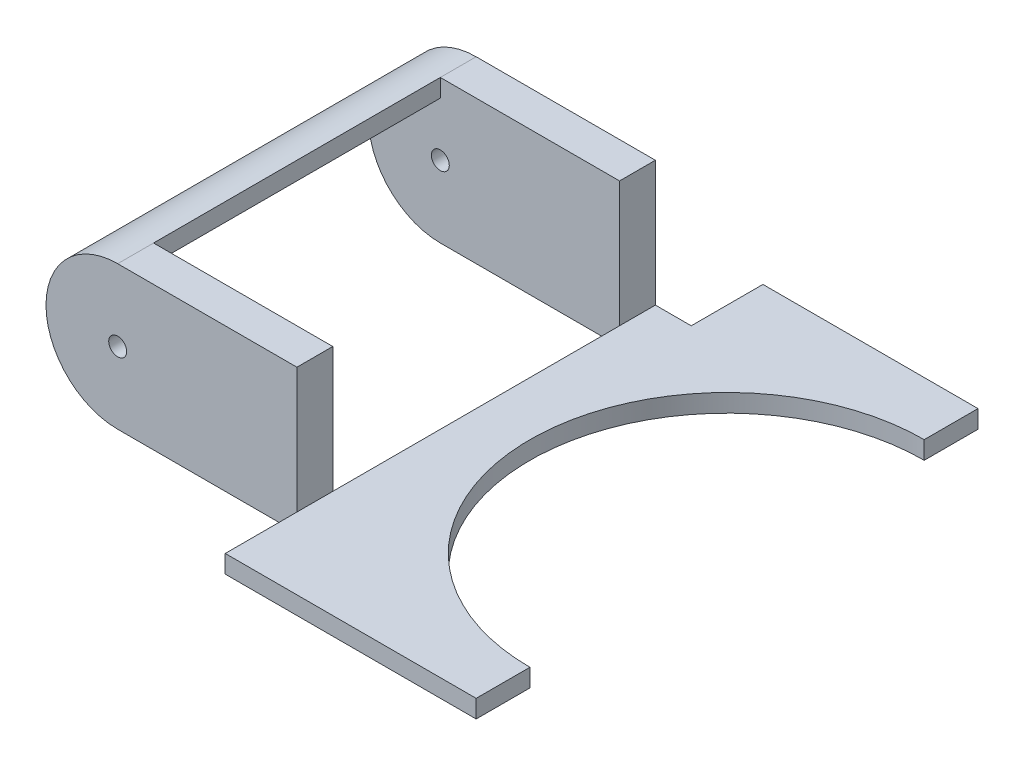
ISO-10303-21;
HEADER;
FILE_DESCRIPTION(('STEP AP214'),'2;1');
FILE_NAME('part.step','',(''),(''),'','','');
FILE_SCHEMA(('AUTOMOTIVE_DESIGN { 1 0 10303 214 1 1 1 1 }'));
ENDSEC;
DATA;
#1=APPLICATION_CONTEXT('core data for automotive mechanical design processes');
#2=APPLICATION_PROTOCOL_DEFINITION('international standard','automotive_design',2000,#1);
#3=PRODUCT_CONTEXT('',#1,'mechanical');
#4=PRODUCT('Part','Part','',(#3));
#5=PRODUCT_RELATED_PRODUCT_CATEGORY('part','',(#4));
#6=PRODUCT_DEFINITION_FORMATION('','',#4);
#7=PRODUCT_DEFINITION_CONTEXT('part definition',#1,'design');
#8=PRODUCT_DEFINITION('design','',#6,#7);
#9=PRODUCT_DEFINITION_SHAPE('','',#8);
#10=(LENGTH_UNIT() NAMED_UNIT(*) SI_UNIT(.MILLI.,.METRE.));
#11=(NAMED_UNIT(*) PLANE_ANGLE_UNIT() SI_UNIT($,.RADIAN.));
#12=(NAMED_UNIT(*) SI_UNIT($,.STERADIAN.) SOLID_ANGLE_UNIT());
#13=UNCERTAINTY_MEASURE_WITH_UNIT(LENGTH_MEASURE(1.E-05),#10,'distance_accuracy_value','');
#14=(GEOMETRIC_REPRESENTATION_CONTEXT(3) GLOBAL_UNCERTAINTY_ASSIGNED_CONTEXT((#13)) GLOBAL_UNIT_ASSIGNED_CONTEXT((#10,
#11,#12)) REPRESENTATION_CONTEXT('',''));
#15=CARTESIAN_POINT('',(0.,0.,0.));
#16=DIRECTION('',(0.,0.,1.));
#17=DIRECTION('',(1.,0.,0.));
#18=AXIS2_PLACEMENT_3D('',#15,#16,#17);
#19=CARTESIAN_POINT('',(70.0000000000002,-20.,100.));
#20=DIRECTION('',(1.,0.,0.));
#21=DIRECTION('',(0.,1.,0.));
#22=AXIS2_PLACEMENT_3D('',#19,#20,#21);
#23=PLANE('',#22);
#24=DIRECTION('',(0.,-1.,0.));
#25=VECTOR('',#24,1.);
#26=CARTESIAN_POINT('',(70.0000000000002,-15.,105.));
#27=LINE('',#26,#25);
#28=CARTESIAN_POINT('',(70.0000000000002,-15.,105.));
#29=VERTEX_POINT('',#28);
#30=CARTESIAN_POINT('',(70.0000000000002,-20.,105.));
#31=VERTEX_POINT('',#30);
#32=EDGE_CURVE('E11',#29,#31,#27,.T.);
#33=ORIENTED_EDGE('',*,*,#32,.F.);
#34=DIRECTION('',(0.,0.,-1.));
#35=VECTOR('',#34,1.);
#36=CARTESIAN_POINT('',(70.0000000000002,-15.,100.));
#37=LINE('',#36,#35);
#38=CARTESIAN_POINT('',(70.,-15.,120.));
#39=VERTEX_POINT('',#38);
#40=EDGE_CURVE('E208',#39,#29,#37,.T.);
#41=ORIENTED_EDGE('',*,*,#40,.F.);
#42=DIRECTION('',(0.,-1.,0.));
#43=VECTOR('',#42,1.);
#44=CARTESIAN_POINT('',(70.,-15.,120.));
#45=LINE('',#44,#43);
#46=CARTESIAN_POINT('',(70.,-20.,120.));
#47=VERTEX_POINT('',#46);
#48=EDGE_CURVE('E200',#39,#47,#45,.T.);
#49=ORIENTED_EDGE('',*,*,#48,.T.);
#50=DIRECTION('',(0.,0.,-1.));
#51=VECTOR('',#50,1.);
#52=CARTESIAN_POINT('',(70.0000000000002,-20.,100.));
#53=LINE('',#52,#51);
#54=EDGE_CURVE('E203',#47,#31,#53,.T.);
#55=ORIENTED_EDGE('',*,*,#54,.T.);
#56=EDGE_LOOP('',(#33,#41,#49,#55));
#57=FACE_BOUND('',#56,.T.);
#58=ADVANCED_FACE('F41',(#57),#23,.T.);
#59=CARTESIAN_POINT('',(-50.,20.,100.));
#60=DIRECTION('',(0.,-1.,0.));
#61=DIRECTION('',(1.,0.,0.));
#62=AXIS2_PLACEMENT_3D('',#59,#60,#61);
#63=PLANE('',#62);
#64=DIRECTION('',(0.,0.,-1.));
#65=VECTOR('',#64,1.);
#66=CARTESIAN_POINT('',(-50.,20.,100.));
#67=LINE('',#66,#65);
#68=CARTESIAN_POINT('',(-50.,20.,9.99999999999999));
#69=VERTEX_POINT('',#68);
#70=CARTESIAN_POINT('',(-50.,20.,0.));
#71=VERTEX_POINT('',#70);
#72=EDGE_CURVE('E277',#69,#71,#67,.T.);
#73=ORIENTED_EDGE('',*,*,#72,.F.);
#74=DIRECTION('',(-1.,0.,0.));
#75=VECTOR('',#74,1.);
#76=CARTESIAN_POINT('',(0.,20.,9.99999999999999));
#77=LINE('',#76,#75);
#78=CARTESIAN_POINT('',(0.,20.,9.99999999999999));
#79=VERTEX_POINT('',#78);
#80=EDGE_CURVE('E215',#79,#69,#77,.T.);
#81=ORIENTED_EDGE('',*,*,#80,.F.);
#82=DIRECTION('',(0.,0.,1.));
#83=VECTOR('',#82,1.);
#84=CARTESIAN_POINT('',(0.,20.,0.));
#85=LINE('',#84,#83);
#86=CARTESIAN_POINT('',(0.,20.,0.));
#87=VERTEX_POINT('',#86);
#88=EDGE_CURVE('E230',#87,#79,#85,.T.);
#89=ORIENTED_EDGE('',*,*,#88,.F.);
#90=DIRECTION('',(-1.,0.,0.));
#91=VECTOR('',#90,1.);
#92=CARTESIAN_POINT('',(-50.,20.,0.));
#93=LINE('',#92,#91);
#94=EDGE_CURVE('E273',#87,#71,#93,.T.);
#95=ORIENTED_EDGE('',*,*,#94,.T.);
#96=EDGE_LOOP('',(#73,#81,#89,#95));
#97=FACE_BOUND('',#96,.T.);
#98=ADVANCED_FACE('F388',(#97),#63,.F.);
#99=CARTESIAN_POINT('',(0.,-15.,0.));
#100=DIRECTION('',(-1.,0.,0.));
#101=DIRECTION('',(0.,-1.,0.));
#102=AXIS2_PLACEMENT_3D('',#99,#100,#101);
#103=PLANE('',#102);
#104=ORIENTED_EDGE('',*,*,#88,.T.);
#105=DIRECTION('',(0.,-1.,0.));
#106=VECTOR('',#105,1.);
#107=CARTESIAN_POINT('',(0.,15.,9.99999999999999));
#108=LINE('',#107,#106);
#109=CARTESIAN_POINT('',(0.,-15.,9.99999999999999));
#110=VERTEX_POINT('',#109);
#111=EDGE_CURVE('E255',#79,#110,#108,.T.);
#112=ORIENTED_EDGE('',*,*,#111,.T.);
#113=DIRECTION('',(0.,0.,1.));
#114=VECTOR('',#113,1.);
#115=CARTESIAN_POINT('',(0.,-15.,0.));
#116=LINE('',#115,#114);
#117=CARTESIAN_POINT('',(0.,-15.,0.));
#118=VERTEX_POINT('',#117);
#119=EDGE_CURVE('E225',#118,#110,#116,.T.);
#120=ORIENTED_EDGE('',*,*,#119,.F.);
#121=DIRECTION('',(0.,1.,0.));
#122=VECTOR('',#121,1.);
#123=CARTESIAN_POINT('',(0.,-15.,0.));
#124=LINE('',#123,#122);
#125=EDGE_CURVE('E228',#118,#87,#124,.T.);
#126=ORIENTED_EDGE('',*,*,#125,.T.);
#127=EDGE_LOOP('',(#104,#112,#120,#126));
#128=FACE_BOUND('',#127,.T.);
#129=ADVANCED_FACE('F383',(#128),#103,.F.);
#130=CARTESIAN_POINT('',(0.,15.,0.));
#131=DIRECTION('',(-1.,0.,0.));
#132=DIRECTION('',(0.,-1.,0.));
#133=AXIS2_PLACEMENT_3D('',#130,#131,#132);
#134=PLANE('',#133);
#135=DIRECTION('',(0.,-1.,0.));
#136=VECTOR('',#135,1.);
#137=CARTESIAN_POINT('',(0.,15.,90.));
#138=LINE('',#137,#136);
#139=CARTESIAN_POINT('',(0.,-15.,90.));
#140=VERTEX_POINT('',#139);
#141=CARTESIAN_POINT('',(0.,-20.,90.));
#142=VERTEX_POINT('',#141);
#143=EDGE_CURVE('E254',#140,#142,#138,.T.);
#144=ORIENTED_EDGE('',*,*,#143,.F.);
#145=DIRECTION('',(0.,0.,-1.));
#146=VECTOR('',#145,1.);
#147=CARTESIAN_POINT('',(0.,-15.,0.));
#148=LINE('',#147,#146);
#149=EDGE_CURVE('E298',#140,#110,#148,.T.);
#150=ORIENTED_EDGE('',*,*,#149,.T.);
#151=CARTESIAN_POINT('',(0.,-20.,9.99999999999999));
#152=VERTEX_POINT('',#151);
#153=EDGE_CURVE('E244',#110,#152,#108,.T.);
#154=ORIENTED_EDGE('',*,*,#153,.T.);
#155=DIRECTION('',(0.,0.,-1.));
#156=VECTOR('',#155,1.);
#157=CARTESIAN_POINT('',(0.,-20.,0.));
#158=LINE('',#157,#156);
#159=EDGE_CURVE('E247',#142,#152,#158,.T.);
#160=ORIENTED_EDGE('',*,*,#159,.F.);
#161=EDGE_LOOP('',(#144,#150,#154,#160));
#162=FACE_BOUND('',#161,.T.);
#163=ADVANCED_FACE('F367',(#162),#134,.T.);
#164=CARTESIAN_POINT('',(-50.,0.,0.));
#165=DIRECTION('',(0.,0.,1.));
#166=DIRECTION('',(1.,0.,0.));
#167=AXIS2_PLACEMENT_3D('',#164,#165,#166);
#168=CYLINDRICAL_SURFACE('',#167,2.5);
#169=CARTESIAN_POINT('',(-50.,0.,90.));
#170=DIRECTION('',(0.,0.,1.));
#171=DIRECTION('',(1.,0.,0.));
#172=AXIS2_PLACEMENT_3D('',#169,#170,#171);
#173=CIRCLE('',#172,2.5);
#174=CARTESIAN_POINT('',(-47.5,0.,90.));
#175=VERTEX_POINT('',#174);
#176=EDGE_CURVE('E259',#175,#175,#173,.F.);
#177=ORIENTED_EDGE('',*,*,#176,.T.);
#178=EDGE_LOOP('',(#177));
#179=FACE_BOUND('',#178,.T.);
#180=CARTESIAN_POINT('',(-50.,0.,100.));
#181=DIRECTION('',(0.,0.,1.));
#182=DIRECTION('',(1.,0.,0.));
#183=AXIS2_PLACEMENT_3D('',#180,#181,#182);
#184=CIRCLE('',#183,2.5);
#185=CARTESIAN_POINT('',(-47.5,0.,100.));
#186=VERTEX_POINT('',#185);
#187=EDGE_CURVE('E262',#186,#186,#184,.T.);
#188=ORIENTED_EDGE('',*,*,#187,.T.);
#189=EDGE_LOOP('',(#188));
#190=FACE_BOUND('',#189,.T.);
#191=ADVANCED_FACE('F405',(#179,#190),#168,.F.);
#192=CARTESIAN_POINT('',(-50.,0.,100.));
#193=DIRECTION('',(0.,0.,-1.));
#194=DIRECTION('',(-1.,0.,0.));
#195=AXIS2_PLACEMENT_3D('',#192,#193,#194);
#196=CYLINDRICAL_SURFACE('',#195,20.);
#197=CARTESIAN_POINT('',(-50.,0.,90.));
#198=DIRECTION('',(0.,0.,1.));
#199=DIRECTION('',(1.,0.,0.));
#200=AXIS2_PLACEMENT_3D('',#197,#198,#199);
#201=CIRCLE('',#200,20.);
#202=CARTESIAN_POINT('',(-63.228756555323,15.,90.));
#203=VERTEX_POINT('',#202);
#204=CARTESIAN_POINT('',(-50.,-20.,90.));
#205=VERTEX_POINT('',#204);
#206=EDGE_CURVE('E260',#203,#205,#201,.T.);
#207=ORIENTED_EDGE('',*,*,#206,.T.);
#208=DIRECTION('',(0.,0.,-1.));
#209=VECTOR('',#208,1.);
#210=CARTESIAN_POINT('',(-50.,-20.,100.));
#211=LINE('',#210,#209);
#212=CARTESIAN_POINT('',(-50.,-20.,100.));
#213=VERTEX_POINT('',#212);
#214=EDGE_CURVE('E288',#213,#205,#211,.T.);
#215=ORIENTED_EDGE('',*,*,#214,.F.);
#216=CARTESIAN_POINT('',(-50.,0.,100.));
#217=DIRECTION('',(0.,0.,1.));
#218=DIRECTION('',(1.,0.,0.));
#219=AXIS2_PLACEMENT_3D('',#216,#217,#218);
#220=CIRCLE('',#219,20.);
#221=CARTESIAN_POINT('',(-50.,20.,100.));
#222=VERTEX_POINT('',#221);
#223=EDGE_CURVE('E269',#222,#213,#220,.T.);
#224=ORIENTED_EDGE('',*,*,#223,.F.);
#225=CARTESIAN_POINT('',(-50.,20.,90.0000000008523));
#226=VERTEX_POINT('',#225);
#227=EDGE_CURVE('E284',#222,#226,#67,.T.);
#228=ORIENTED_EDGE('',*,*,#227,.T.);
#229=DIRECTION('',(0.,0.,1.));
#230=VECTOR('',#229,1.);
#231=CARTESIAN_POINT('',(-50.,20.,9.99999999999999));
#232=LINE('',#231,#230);
#233=EDGE_CURVE('E206',#69,#226,#232,.T.);
#234=ORIENTED_EDGE('',*,*,#233,.F.);
#235=ORIENTED_EDGE('',*,*,#72,.T.);
#236=CARTESIAN_POINT('',(-50.,0.,0.));
#237=DIRECTION('',(0.,0.,1.));
#238=DIRECTION('',(1.,0.,0.));
#239=AXIS2_PLACEMENT_3D('',#236,#237,#238);
#240=CIRCLE('',#239,20.);
#241=CARTESIAN_POINT('',(-50.,-20.,0.));
#242=VERTEX_POINT('',#241);
#243=EDGE_CURVE('E266',#71,#242,#240,.T.);
#244=ORIENTED_EDGE('',*,*,#243,.T.);
#245=CARTESIAN_POINT('',(-50.,-20.,9.99999999999999));
#246=VERTEX_POINT('',#245);
#247=EDGE_CURVE('E287',#246,#242,#211,.T.);
#248=ORIENTED_EDGE('',*,*,#247,.F.);
#249=CARTESIAN_POINT('',(-50.,0.,9.99999999999999));
#250=DIRECTION('',(0.,0.,-1.));
#251=DIRECTION('',(-1.,0.,0.));
#252=AXIS2_PLACEMENT_3D('',#249,#250,#251);
#253=CIRCLE('',#252,20.);
#254=CARTESIAN_POINT('',(-63.228756555323,15.,9.99999999999999));
#255=VERTEX_POINT('',#254);
#256=EDGE_CURVE('E257',#246,#255,#253,.T.);
#257=ORIENTED_EDGE('',*,*,#256,.T.);
#258=DIRECTION('',(0.,0.,-1.));
#259=VECTOR('',#258,1.);
#260=CARTESIAN_POINT('',(-63.228756555323,15.,100.));
#261=LINE('',#260,#259);
#262=EDGE_CURVE('E291',#203,#255,#261,.T.);
#263=ORIENTED_EDGE('',*,*,#262,.F.);
#264=EDGE_LOOP('',(#207,#215,#224,#228,#234,#235,#244,#248,#257,#263));
#265=FACE_BOUND('',#264,.T.);
#266=ADVANCED_FACE('F43',(#265),#196,.T.);
#267=CARTESIAN_POINT('',(-50.,-20.,100.));
#268=DIRECTION('',(0.,1.,0.));
#269=DIRECTION('',(-1.,0.,0.));
#270=AXIS2_PLACEMENT_3D('',#267,#268,#269);
#271=PLANE('',#270);
#272=DIRECTION('',(1.,0.,0.));
#273=VECTOR('',#272,1.);
#274=CARTESIAN_POINT('',(-50.,-20.,0.));
#275=LINE('',#274,#273);
#276=CARTESIAN_POINT('',(10.,-20.,0.));
#277=VERTEX_POINT('',#276);
#278=EDGE_CURVE('E280',#242,#277,#275,.T.);
#279=ORIENTED_EDGE('',*,*,#278,.T.);
#280=DIRECTION('',(0.,0.,1.));
#281=VECTOR('',#280,1.);
#282=CARTESIAN_POINT('',(10.,-20.,0.));
#283=LINE('',#282,#281);
#284=CARTESIAN_POINT('',(10.,-20.,-20.));
#285=VERTEX_POINT('',#284);
#286=EDGE_CURVE('E179',#285,#277,#283,.T.);
#287=ORIENTED_EDGE('',*,*,#286,.F.);
#288=DIRECTION('',(1.,0.,0.));
#289=VECTOR('',#288,1.);
#290=CARTESIAN_POINT('',(0.,-20.,-20.));
#291=LINE('',#290,#289);
#292=CARTESIAN_POINT('',(70.,-20.,-20.));
#293=VERTEX_POINT('',#292);
#294=EDGE_CURVE('E187',#285,#293,#291,.T.);
#295=ORIENTED_EDGE('',*,*,#294,.T.);
#296=CARTESIAN_POINT('',(70.0000000000002,-20.,-4.99999999999999));
#297=VERTEX_POINT('',#296);
#298=EDGE_CURVE('E207',#297,#293,#53,.T.);
#299=ORIENTED_EDGE('',*,*,#298,.F.);
#300=CARTESIAN_POINT('',(70.,-20.,50.));
#301=DIRECTION('',(0.,-1.,0.));
#302=DIRECTION('',(1.,0.,0.));
#303=AXIS2_PLACEMENT_3D('',#300,#301,#302);
#304=CIRCLE('',#303,55.);
#305=EDGE_CURVE('E55',#31,#297,#304,.T.);
#306=ORIENTED_EDGE('',*,*,#305,.F.);
#307=ORIENTED_EDGE('',*,*,#54,.F.);
#308=DIRECTION('',(-1.,0.,0.));
#309=VECTOR('',#308,1.);
#310=CARTESIAN_POINT('',(0.,-20.,120.));
#311=LINE('',#310,#309);
#312=CARTESIAN_POINT('',(0.,-20.,120.));
#313=VERTEX_POINT('',#312);
#314=EDGE_CURVE('E307',#47,#313,#311,.T.);
#315=ORIENTED_EDGE('',*,*,#314,.T.);
#316=DIRECTION('',(0.,0.,-1.));
#317=VECTOR('',#316,1.);
#318=CARTESIAN_POINT('',(0.,-20.,100.));
#319=LINE('',#318,#317);
#320=CARTESIAN_POINT('',(0.,-20.,100.));
#321=VERTEX_POINT('',#320);
#322=EDGE_CURVE('E322',#313,#321,#319,.T.);
#323=ORIENTED_EDGE('',*,*,#322,.T.);
#324=DIRECTION('',(1.,0.,0.));
#325=VECTOR('',#324,1.);
#326=CARTESIAN_POINT('',(-50.,-20.,100.));
#327=LINE('',#326,#325);
#328=EDGE_CURVE('E272',#213,#321,#327,.T.);
#329=ORIENTED_EDGE('',*,*,#328,.F.);
#330=ORIENTED_EDGE('',*,*,#214,.T.);
#331=DIRECTION('',(-1.,0.,0.));
#332=VECTOR('',#331,1.);
#333=CARTESIAN_POINT('',(0.,-20.,90.));
#334=LINE('',#333,#332);
#335=EDGE_CURVE('E242',#142,#205,#334,.T.);
#336=ORIENTED_EDGE('',*,*,#335,.F.);
#337=ORIENTED_EDGE('',*,*,#159,.T.);
#338=DIRECTION('',(1.,0.,0.));
#339=VECTOR('',#338,1.);
#340=CARTESIAN_POINT('',(0.,-20.,9.99999999999999));
#341=LINE('',#340,#339);
#342=EDGE_CURVE('E236',#246,#152,#341,.T.);
#343=ORIENTED_EDGE('',*,*,#342,.F.);
#344=ORIENTED_EDGE('',*,*,#247,.T.);
#345=EDGE_LOOP('',(#279,#287,#295,#299,#306,#307,#315,#323,#329,#330,#336,#337,#343,#344));
#346=FACE_BOUND('',#345,.T.);
#347=ADVANCED_FACE('F311',(#346),#271,.F.);
#348=CARTESIAN_POINT('',(0.,20.,90.0000000008523));
#349=VERTEX_POINT('',#348);
#350=CARTESIAN_POINT('',(0.,20.,100.));
#351=VERTEX_POINT('',#350);
#352=EDGE_CURVE('E224',#349,#351,#85,.T.);
#353=ORIENTED_EDGE('',*,*,#352,.F.);
#354=DIRECTION('',(1.,0.,0.));
#355=VECTOR('',#354,1.);
#356=CARTESIAN_POINT('',(-50.,20.,90.0000000008523));
#357=LINE('',#356,#355);
#358=EDGE_CURVE('E213',#226,#349,#357,.T.);
#359=ORIENTED_EDGE('',*,*,#358,.F.);
#360=ORIENTED_EDGE('',*,*,#227,.F.);
#361=DIRECTION('',(-1.,0.,0.));
#362=VECTOR('',#361,1.);
#363=CARTESIAN_POINT('',(-50.,20.,100.));
#364=LINE('',#363,#362);
#365=EDGE_CURVE('E275',#351,#222,#364,.T.);
#366=ORIENTED_EDGE('',*,*,#365,.F.);
#367=EDGE_LOOP('',(#353,#359,#360,#366));
#368=FACE_BOUND('',#367,.T.);
#369=ADVANCED_FACE('F353',(#368),#63,.F.);
#370=CARTESIAN_POINT('',(-50.,0.,100.));
#371=DIRECTION('',(0.,0.,1.));
#372=DIRECTION('',(1.,0.,0.));
#373=AXIS2_PLACEMENT_3D('',#370,#371,#372);
#374=PLANE('',#373);
#375=DIRECTION('',(0.,-1.,0.));
#376=VECTOR('',#375,1.);
#377=CARTESIAN_POINT('',(0.,-15.,100.));
#378=LINE('',#377,#376);
#379=CARTESIAN_POINT('',(0.,-15.,100.));
#380=VERTEX_POINT('',#379);
#381=EDGE_CURVE('E197',#380,#321,#378,.T.);
#382=ORIENTED_EDGE('',*,*,#381,.F.);
#383=DIRECTION('',(0.,1.,0.));
#384=VECTOR('',#383,1.);
#385=CARTESIAN_POINT('',(0.,-15.,100.));
#386=LINE('',#385,#384);
#387=EDGE_CURVE('E233',#380,#351,#386,.T.);
#388=ORIENTED_EDGE('',*,*,#387,.T.);
#389=ORIENTED_EDGE('',*,*,#365,.T.);
#390=ORIENTED_EDGE('',*,*,#223,.T.);
#391=ORIENTED_EDGE('',*,*,#328,.T.);
#392=EDGE_LOOP('',(#382,#388,#389,#390,#391));
#393=FACE_BOUND('',#392,.T.);
#394=ORIENTED_EDGE('',*,*,#187,.F.);
#395=EDGE_LOOP('',(#394));
#396=FACE_BOUND('',#395,.T.);
#397=ADVANCED_FACE('F343',(#393,#396),#374,.T.);
#398=CARTESIAN_POINT('',(-50.,0.,0.));
#399=DIRECTION('',(0.,0.,1.));
#400=DIRECTION('',(1.,0.,0.));
#401=AXIS2_PLACEMENT_3D('',#398,#399,#400);
#402=PLANE('',#401);
#403=CARTESIAN_POINT('',(-50.,0.,0.));
#404=DIRECTION('',(0.,0.,1.));
#405=DIRECTION('',(1.,0.,0.));
#406=AXIS2_PLACEMENT_3D('',#403,#404,#405);
#407=CIRCLE('',#406,2.5);
#408=CARTESIAN_POINT('',(-47.5,0.,0.));
#409=VERTEX_POINT('',#408);
#410=EDGE_CURVE('E263',#409,#409,#407,.T.);
#411=ORIENTED_EDGE('',*,*,#410,.T.);
#412=EDGE_LOOP('',(#411));
#413=FACE_BOUND('',#412,.T.);
#414=ORIENTED_EDGE('',*,*,#125,.F.);
#415=DIRECTION('',(-1.,0.,0.));
#416=VECTOR('',#415,1.);
#417=CARTESIAN_POINT('',(0.,-15.,0.));
#418=LINE('',#417,#416);
#419=CARTESIAN_POINT('',(10.,-15.,0.));
#420=VERTEX_POINT('',#419);
#421=EDGE_CURVE('E178',#420,#118,#418,.T.);
#422=ORIENTED_EDGE('',*,*,#421,.F.);
#423=DIRECTION('',(0.,-1.,0.));
#424=VECTOR('',#423,1.);
#425=CARTESIAN_POINT('',(10.,-15.,0.));
#426=LINE('',#425,#424);
#427=EDGE_CURVE('E174',#420,#277,#426,.T.);
#428=ORIENTED_EDGE('',*,*,#427,.T.);
#429=ORIENTED_EDGE('',*,*,#278,.F.);
#430=ORIENTED_EDGE('',*,*,#243,.F.);
#431=ORIENTED_EDGE('',*,*,#94,.F.);
#432=EDGE_LOOP('',(#414,#422,#428,#429,#430,#431));
#433=FACE_BOUND('',#432,.T.);
#434=ADVANCED_FACE('F380',(#413,#433),#402,.F.);
#435=CARTESIAN_POINT('',(-50.,0.,9.99999999999999));
#436=DIRECTION('',(0.,0.,-1.));
#437=DIRECTION('',(-1.,0.,0.));
#438=AXIS2_PLACEMENT_3D('',#435,#436,#437);
#439=CIRCLE('',#438,2.5);
#440=CARTESIAN_POINT('',(-52.5,0.,9.99999999999999));
#441=VERTEX_POINT('',#440);
#442=EDGE_CURVE('E253',#441,#441,#439,.F.);
#443=ORIENTED_EDGE('',*,*,#442,.T.);
#444=EDGE_LOOP('',(#443));
#445=FACE_BOUND('',#444,.T.);
#446=ORIENTED_EDGE('',*,*,#410,.F.);
#447=EDGE_LOOP('',(#446));
#448=FACE_BOUND('',#447,.T.);
#449=ADVANCED_FACE('F395',(#445,#448),#168,.F.);
#450=CARTESIAN_POINT('',(0.,15.,0.));
#451=DIRECTION('',(0.,-1.,0.));
#452=DIRECTION('',(1.,0.,0.));
#453=AXIS2_PLACEMENT_3D('',#450,#451,#452);
#454=PLANE('',#453);
#455=DIRECTION('',(0.,0.,-1.));
#456=VECTOR('',#455,1.);
#457=CARTESIAN_POINT('',(-50.,15.,0.));
#458=LINE('',#457,#456);
#459=CARTESIAN_POINT('',(-50.,15.,90.0000000008523));
#460=VERTEX_POINT('',#459);
#461=CARTESIAN_POINT('',(-50.,15.,9.99999999999999));
#462=VERTEX_POINT('',#461);
#463=EDGE_CURVE('E221',#460,#462,#458,.T.);
#464=ORIENTED_EDGE('',*,*,#463,.F.);
#465=DIRECTION('',(-1.,0.,0.));
#466=VECTOR('',#465,1.);
#467=CARTESIAN_POINT('',(0.,15.,90.));
#468=LINE('',#467,#466);
#469=EDGE_CURVE('E241',#460,#203,#468,.T.);
#470=ORIENTED_EDGE('',*,*,#469,.T.);
#471=ORIENTED_EDGE('',*,*,#262,.T.);
#472=DIRECTION('',(1.,0.,0.));
#473=VECTOR('',#472,1.);
#474=CARTESIAN_POINT('',(0.,15.,9.99999999999999));
#475=LINE('',#474,#473);
#476=EDGE_CURVE('E238',#255,#462,#475,.T.);
#477=ORIENTED_EDGE('',*,*,#476,.T.);
#478=EDGE_LOOP('',(#464,#470,#471,#477));
#479=FACE_BOUND('',#478,.T.);
#480=ADVANCED_FACE('F393',(#479),#454,.T.);
#481=CARTESIAN_POINT('',(0.,15.,90.));
#482=DIRECTION('',(0.,0.,1.));
#483=DIRECTION('',(1.,0.,0.));
#484=AXIS2_PLACEMENT_3D('',#481,#482,#483);
#485=PLANE('',#484);
#486=ORIENTED_EDGE('',*,*,#176,.F.);
#487=EDGE_LOOP('',(#486));
#488=FACE_BOUND('',#487,.T.);
#489=ORIENTED_EDGE('',*,*,#469,.F.);
#490=DIRECTION('',(0.,1.,0.));
#491=VECTOR('',#490,1.);
#492=CARTESIAN_POINT('',(-50.,0.,90.0000000008523));
#493=LINE('',#492,#491);
#494=EDGE_CURVE('E218',#460,#226,#493,.T.);
#495=ORIENTED_EDGE('',*,*,#494,.T.);
#496=ORIENTED_EDGE('',*,*,#358,.T.);
#497=EDGE_CURVE('E63',#349,#140,#138,.T.);
#498=ORIENTED_EDGE('',*,*,#497,.T.);
#499=ORIENTED_EDGE('',*,*,#143,.T.);
#500=ORIENTED_EDGE('',*,*,#335,.T.);
#501=ORIENTED_EDGE('',*,*,#206,.F.);
#502=EDGE_LOOP('',(#489,#495,#496,#498,#499,#500,#501));
#503=FACE_BOUND('',#502,.T.);
#504=ADVANCED_FACE('F365',(#488,#503),#485,.F.);
#505=CARTESIAN_POINT('',(0.,15.,9.99999999999999));
#506=DIRECTION('',(0.,0.,-1.));
#507=DIRECTION('',(-1.,0.,0.));
#508=AXIS2_PLACEMENT_3D('',#505,#506,#507);
#509=PLANE('',#508);
#510=ORIENTED_EDGE('',*,*,#111,.F.);
#511=ORIENTED_EDGE('',*,*,#80,.T.);
#512=DIRECTION('',(0.,1.,0.));
#513=VECTOR('',#512,1.);
#514=CARTESIAN_POINT('',(-50.,0.,9.99999999999999));
#515=LINE('',#514,#513);
#516=EDGE_CURVE('E219',#462,#69,#515,.T.);
#517=ORIENTED_EDGE('',*,*,#516,.F.);
#518=ORIENTED_EDGE('',*,*,#476,.F.);
#519=ORIENTED_EDGE('',*,*,#256,.F.);
#520=ORIENTED_EDGE('',*,*,#342,.T.);
#521=ORIENTED_EDGE('',*,*,#153,.F.);
#522=EDGE_LOOP('',(#510,#511,#517,#518,#519,#520,#521));
#523=FACE_BOUND('',#522,.T.);
#524=ORIENTED_EDGE('',*,*,#442,.F.);
#525=EDGE_LOOP('',(#524));
#526=FACE_BOUND('',#525,.T.);
#527=ADVANCED_FACE('F370',(#523,#526),#509,.F.);
#528=ORIENTED_EDGE('',*,*,#497,.F.);
#529=ORIENTED_EDGE('',*,*,#352,.T.);
#530=ORIENTED_EDGE('',*,*,#387,.F.);
#531=EDGE_CURVE('E229',#140,#380,#116,.T.);
#532=ORIENTED_EDGE('',*,*,#531,.F.);
#533=EDGE_LOOP('',(#528,#529,#530,#532));
#534=FACE_BOUND('',#533,.T.);
#535=ADVANCED_FACE('F349',(#534),#103,.F.);
#536=CARTESIAN_POINT('',(0.,-15.,0.));
#537=DIRECTION('',(0.,1.,0.));
#538=DIRECTION('',(-1.,0.,0.));
#539=AXIS2_PLACEMENT_3D('',#536,#537,#538);
#540=PLANE('',#539);
#541=ORIENTED_EDGE('',*,*,#421,.T.);
#542=ORIENTED_EDGE('',*,*,#119,.T.);
#543=ORIENTED_EDGE('',*,*,#149,.F.);
#544=ORIENTED_EDGE('',*,*,#531,.T.);
#545=DIRECTION('',(0.,0.,-1.));
#546=VECTOR('',#545,1.);
#547=CARTESIAN_POINT('',(0.,-15.,100.));
#548=LINE('',#547,#546);
#549=CARTESIAN_POINT('',(0.,-15.,120.));
#550=VERTEX_POINT('',#549);
#551=EDGE_CURVE('E321',#550,#380,#548,.T.);
#552=ORIENTED_EDGE('',*,*,#551,.F.);
#553=DIRECTION('',(-1.,0.,0.));
#554=VECTOR('',#553,1.);
#555=CARTESIAN_POINT('',(0.,-15.,120.));
#556=LINE('',#555,#554);
#557=EDGE_CURVE('E318',#39,#550,#556,.T.);
#558=ORIENTED_EDGE('',*,*,#557,.F.);
#559=ORIENTED_EDGE('',*,*,#40,.T.);
#560=CARTESIAN_POINT('',(70.,-15.,50.));
#561=DIRECTION('',(0.,-1.,0.));
#562=DIRECTION('',(1.,0.,0.));
#563=AXIS2_PLACEMENT_3D('',#560,#561,#562);
#564=CIRCLE('',#563,55.);
#565=CARTESIAN_POINT('',(70.0000000000002,-15.,-5.));
#566=VERTEX_POINT('',#565);
#567=EDGE_CURVE('E301',#29,#566,#564,.T.);
#568=ORIENTED_EDGE('',*,*,#567,.T.);
#569=CARTESIAN_POINT('',(70.,-15.,-20.));
#570=VERTEX_POINT('',#569);
#571=EDGE_CURVE('E192',#566,#570,#37,.T.);
#572=ORIENTED_EDGE('',*,*,#571,.T.);
#573=DIRECTION('',(1.,0.,0.));
#574=VECTOR('',#573,1.);
#575=CARTESIAN_POINT('',(0.,-15.,-20.));
#576=LINE('',#575,#574);
#577=CARTESIAN_POINT('',(10.,-15.,-20.));
#578=VERTEX_POINT('',#577);
#579=EDGE_CURVE('E185',#578,#570,#576,.T.);
#580=ORIENTED_EDGE('',*,*,#579,.F.);
#581=DIRECTION('',(0.,0.,1.));
#582=VECTOR('',#581,1.);
#583=CARTESIAN_POINT('',(10.,-15.,0.));
#584=LINE('',#583,#582);
#585=EDGE_CURVE('E167',#578,#420,#584,.T.);
#586=ORIENTED_EDGE('',*,*,#585,.T.);
#587=EDGE_LOOP('',(#541,#542,#543,#544,#552,#558,#559,#568,#572,#580,#586));
#588=FACE_BOUND('',#587,.T.);
#589=ADVANCED_FACE('F189',(#588),#540,.T.);
#590=CARTESIAN_POINT('',(-50.,0.,9.99999999999999));
#591=DIRECTION('',(-1.,0.,0.));
#592=DIRECTION('',(0.,-1.,0.));
#593=AXIS2_PLACEMENT_3D('',#590,#591,#592);
#594=PLANE('',#593);
#595=ORIENTED_EDGE('',*,*,#463,.T.);
#596=ORIENTED_EDGE('',*,*,#516,.T.);
#597=ORIENTED_EDGE('',*,*,#233,.T.);
#598=ORIENTED_EDGE('',*,*,#494,.F.);
#599=EDGE_LOOP('',(#595,#596,#597,#598));
#600=FACE_BOUND('',#599,.T.);
#601=ADVANCED_FACE('F390',(#600),#594,.F.);
#602=DIRECTION('',(0.,-1.,0.));
#603=VECTOR('',#602,1.);
#604=CARTESIAN_POINT('',(70.0000000000002,-15.,-5.));
#605=LINE('',#604,#603);
#606=EDGE_CURVE('E49',#297,#566,#605,.F.);
#607=ORIENTED_EDGE('',*,*,#606,.F.);
#608=ORIENTED_EDGE('',*,*,#298,.T.);
#609=DIRECTION('',(0.,-1.,0.));
#610=VECTOR('',#609,1.);
#611=CARTESIAN_POINT('',(70.,-15.,-20.));
#612=LINE('',#611,#610);
#613=EDGE_CURVE('E194',#570,#293,#612,.T.);
#614=ORIENTED_EDGE('',*,*,#613,.F.);
#615=ORIENTED_EDGE('',*,*,#571,.F.);
#616=EDGE_LOOP('',(#607,#608,#614,#615));
#617=FACE_BOUND('',#616,.T.);
#618=ADVANCED_FACE('F309',(#617),#23,.T.);
#619=CARTESIAN_POINT('',(0.,-15.,-20.));
#620=DIRECTION('',(0.,0.,-1.));
#621=DIRECTION('',(-1.,0.,0.));
#622=AXIS2_PLACEMENT_3D('',#619,#620,#621);
#623=PLANE('',#622);
#624=DIRECTION('',(0.,-1.,0.));
#625=VECTOR('',#624,1.);
#626=CARTESIAN_POINT('',(10.,-15.,-20.));
#627=LINE('',#626,#625);
#628=EDGE_CURVE('E171',#578,#285,#627,.T.);
#629=ORIENTED_EDGE('',*,*,#628,.F.);
#630=ORIENTED_EDGE('',*,*,#579,.T.);
#631=ORIENTED_EDGE('',*,*,#613,.T.);
#632=ORIENTED_EDGE('',*,*,#294,.F.);
#633=EDGE_LOOP('',(#629,#630,#631,#632));
#634=FACE_BOUND('',#633,.T.);
#635=ADVANCED_FACE('F183',(#634),#623,.T.);
#636=CARTESIAN_POINT('',(0.,-15.,100.));
#637=DIRECTION('',(-1.,0.,0.));
#638=DIRECTION('',(0.,0.,1.));
#639=AXIS2_PLACEMENT_3D('',#636,#637,#638);
#640=PLANE('',#639);
#641=ORIENTED_EDGE('',*,*,#322,.F.);
#642=DIRECTION('',(0.,-1.,0.));
#643=VECTOR('',#642,1.);
#644=CARTESIAN_POINT('',(0.,-15.,120.));
#645=LINE('',#644,#643);
#646=EDGE_CURVE('E330',#550,#313,#645,.T.);
#647=ORIENTED_EDGE('',*,*,#646,.F.);
#648=ORIENTED_EDGE('',*,*,#551,.T.);
#649=ORIENTED_EDGE('',*,*,#381,.T.);
#650=EDGE_LOOP('',(#641,#647,#648,#649));
#651=FACE_BOUND('',#650,.T.);
#652=ADVANCED_FACE('F339',(#651),#640,.T.);
#653=CARTESIAN_POINT('',(0.,-15.,120.));
#654=DIRECTION('',(0.,0.,1.));
#655=DIRECTION('',(1.,0.,0.));
#656=AXIS2_PLACEMENT_3D('',#653,#654,#655);
#657=PLANE('',#656);
#658=ORIENTED_EDGE('',*,*,#314,.F.);
#659=ORIENTED_EDGE('',*,*,#48,.F.);
#660=ORIENTED_EDGE('',*,*,#557,.T.);
#661=ORIENTED_EDGE('',*,*,#646,.T.);
#662=EDGE_LOOP('',(#658,#659,#660,#661));
#663=FACE_BOUND('',#662,.T.);
#664=ADVANCED_FACE('F336',(#663),#657,.T.);
#665=CARTESIAN_POINT('',(70.,-15.,50.));
#666=DIRECTION('',(0.,-1.,0.));
#667=DIRECTION('',(1.,0.,0.));
#668=AXIS2_PLACEMENT_3D('',#665,#666,#667);
#669=CYLINDRICAL_SURFACE('',#668,55.);
#670=ORIENTED_EDGE('',*,*,#32,.T.);
#671=ORIENTED_EDGE('',*,*,#305,.T.);
#672=ORIENTED_EDGE('',*,*,#606,.T.);
#673=ORIENTED_EDGE('',*,*,#567,.F.);
#674=EDGE_LOOP('',(#670,#671,#672,#673));
#675=FACE_BOUND('',#674,.T.);
#676=ADVANCED_FACE('F300',(#675),#669,.F.);
#677=CARTESIAN_POINT('',(10.,-15.,0.));
#678=DIRECTION('',(1.,0.,0.));
#679=DIRECTION('',(0.,1.,0.));
#680=AXIS2_PLACEMENT_3D('',#677,#678,#679);
#681=PLANE('',#680);
#682=ORIENTED_EDGE('',*,*,#286,.T.);
#683=ORIENTED_EDGE('',*,*,#427,.F.);
#684=ORIENTED_EDGE('',*,*,#585,.F.);
#685=ORIENTED_EDGE('',*,*,#628,.T.);
#686=EDGE_LOOP('',(#682,#683,#684,#685));
#687=FACE_BOUND('',#686,.T.);
#688=ADVANCED_FACE('F170',(#687),#681,.F.);
#689=CLOSED_SHELL('',(#58,#98,#129,#163,#191,#266,#347,#369,#397,#434,#449,#480,#504,#527,#535,
#589,#601,#618,#635,#652,#664,#676,#688));
#690=MANIFOLD_SOLID_BREP('B2',#689);
#691=ADVANCED_BREP_SHAPE_REPRESENTATION('',(#18,#690),#14);
#692=SHAPE_DEFINITION_REPRESENTATION(#9,#691);
ENDSEC;
END-ISO-10303-21;
